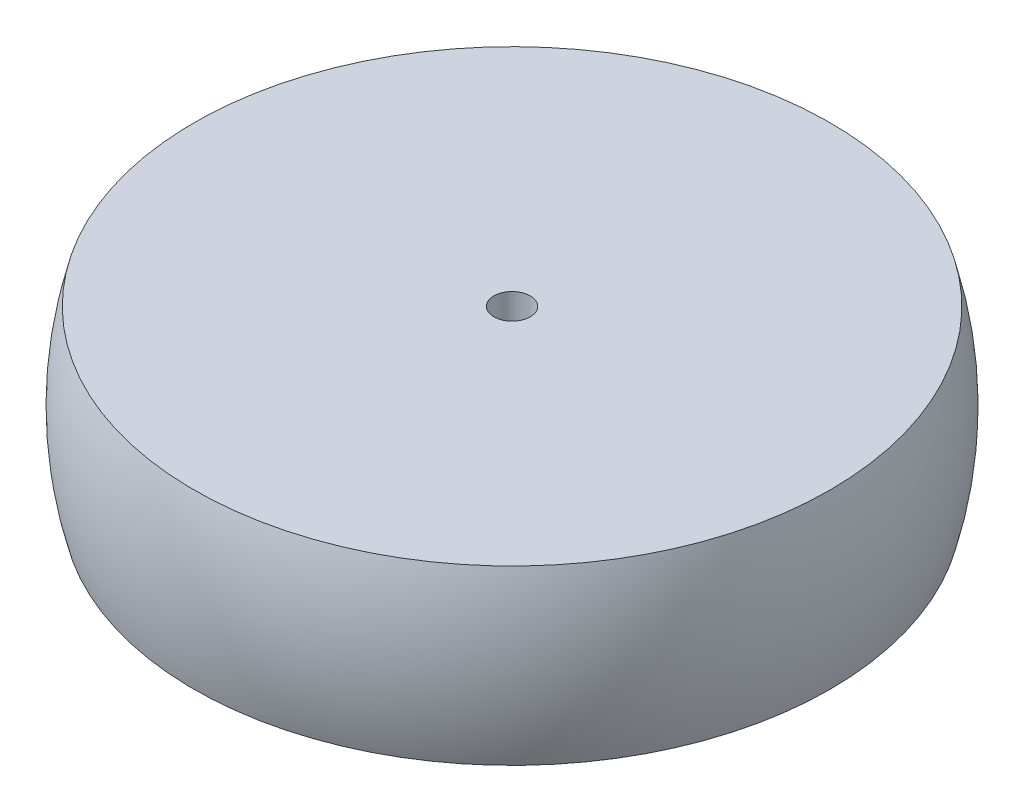
ISO-10303-21;
HEADER;
FILE_DESCRIPTION(('STEP AP214'),'2;1');
FILE_NAME('part.step','',(''),(''),'','','');
FILE_SCHEMA(('AUTOMOTIVE_DESIGN { 1 0 10303 214 1 1 1 1 }'));
ENDSEC;
DATA;
#1=APPLICATION_CONTEXT('core data for automotive mechanical design processes');
#2=APPLICATION_PROTOCOL_DEFINITION('international standard','automotive_design',2000,#1);
#3=PRODUCT_CONTEXT('',#1,'mechanical');
#4=PRODUCT('Part','Part','',(#3));
#5=PRODUCT_RELATED_PRODUCT_CATEGORY('part','',(#4));
#6=PRODUCT_DEFINITION_FORMATION('','',#4);
#7=PRODUCT_DEFINITION_CONTEXT('part definition',#1,'design');
#8=PRODUCT_DEFINITION('design','',#6,#7);
#9=PRODUCT_DEFINITION_SHAPE('','',#8);
#10=(LENGTH_UNIT() NAMED_UNIT(*) SI_UNIT(.MILLI.,.METRE.));
#11=(NAMED_UNIT(*) PLANE_ANGLE_UNIT() SI_UNIT($,.RADIAN.));
#12=(NAMED_UNIT(*) SI_UNIT($,.STERADIAN.) SOLID_ANGLE_UNIT());
#13=UNCERTAINTY_MEASURE_WITH_UNIT(LENGTH_MEASURE(1.E-05),#10,'distance_accuracy_value','');
#14=(GEOMETRIC_REPRESENTATION_CONTEXT(3) GLOBAL_UNCERTAINTY_ASSIGNED_CONTEXT((#13)) GLOBAL_UNIT_ASSIGNED_CONTEXT((#10,
#11,#12)) REPRESENTATION_CONTEXT('',''));
#15=CARTESIAN_POINT('',(0.,0.,0.));
#16=DIRECTION('',(0.,0.,1.));
#17=DIRECTION('',(1.,0.,0.));
#18=AXIS2_PLACEMENT_3D('',#15,#16,#17);
#19=CARTESIAN_POINT('',(0.,0.,0.));
#20=DIRECTION('',(0.,-1.,0.));
#21=DIRECTION('',(0.,0.,-1.));
#22=AXIS2_PLACEMENT_3D('',#19,#20,#21);
#23=PLANE('',#22);
#24=CARTESIAN_POINT('',(0.,0.,0.));
#25=DIRECTION('',(0.,-1.,0.));
#26=DIRECTION('',(0.,0.,-1.));
#27=AXIS2_PLACEMENT_3D('',#24,#25,#26);
#28=CIRCLE('',#27,2.);
#29=CARTESIAN_POINT('',(0.,0.,-2.));
#30=VERTEX_POINT('',#29);
#31=EDGE_CURVE('E50',#30,#30,#28,.T.);
#32=ORIENTED_EDGE('',*,*,#31,.F.);
#33=EDGE_LOOP('',(#32));
#34=FACE_BOUND('',#33,.T.);
#35=CARTESIAN_POINT('',(0.,0.,0.));
#36=DIRECTION('',(0.,-1.,0.));
#37=DIRECTION('',(0.,0.,-1.));
#38=AXIS2_PLACEMENT_3D('',#35,#36,#37);
#39=CIRCLE('',#38,6.);
#40=CARTESIAN_POINT('',(0.,0.,-6.));
#41=VERTEX_POINT('',#40);
#42=EDGE_CURVE('E44',#41,#41,#39,.T.);
#43=ORIENTED_EDGE('',*,*,#42,.T.);
#44=EDGE_LOOP('',(#43));
#45=FACE_BOUND('',#44,.T.);
#46=ADVANCED_FACE('F30',(#34,#45),#23,.T.);
#47=CARTESIAN_POINT('',(0.,25.,0.));
#48=DIRECTION('',(0.,1.,0.));
#49=DIRECTION('',(0.,0.,1.));
#50=AXIS2_PLACEMENT_3D('',#47,#48,#49);
#51=PLANE('',#50);
#52=CARTESIAN_POINT('',(0.,25.,0.));
#53=DIRECTION('',(0.,-1.,0.));
#54=DIRECTION('',(0.,0.,-1.));
#55=AXIS2_PLACEMENT_3D('',#52,#53,#54);
#56=CIRCLE('',#55,2.);
#57=CARTESIAN_POINT('',(0.,25.,-2.));
#58=VERTEX_POINT('',#57);
#59=EDGE_CURVE('E49',#58,#58,#56,.T.);
#60=ORIENTED_EDGE('',*,*,#59,.T.);
#61=EDGE_LOOP('',(#60));
#62=FACE_BOUND('',#61,.T.);
#63=CARTESIAN_POINT('',(0.,25.,0.));
#64=DIRECTION('',(0.,-1.,0.));
#65=DIRECTION('',(0.,0.,-1.));
#66=AXIS2_PLACEMENT_3D('',#63,#64,#65);
#67=CIRCLE('',#66,35.);
#68=CARTESIAN_POINT('',(35.,25.,0.));
#69=VERTEX_POINT('',#68);
#70=EDGE_CURVE('E10',#69,#69,#67,.T.);
#71=ORIENTED_EDGE('',*,*,#70,.F.);
#72=EDGE_LOOP('',(#71));
#73=FACE_BOUND('',#72,.T.);
#74=ADVANCED_FACE('F56',(#62,#73),#51,.T.);
#75=CARTESIAN_POINT('',(0.,15.5,0.));
#76=DIRECTION('',(0.,-1.,0.));
#77=DIRECTION('',(1.,0.,0.));
#78=AXIS2_PLACEMENT_3D('',#75,#76,#77);
#79=SPHERICAL_SURFACE('',#78,36.2663756115772);
#80=CARTESIAN_POINT('',(0.,6.00000000000001,0.));
#81=DIRECTION('',(0.,-1.,0.));
#82=DIRECTION('',(0.,0.,-1.));
#83=AXIS2_PLACEMENT_3D('',#80,#81,#82);
#84=CIRCLE('',#83,35.);
#85=CARTESIAN_POINT('',(35.,6.00000000000001,0.));
#86=VERTEX_POINT('',#85);
#87=EDGE_CURVE('E36',#86,#86,#84,.T.);
#88=CARTESIAN_POINT('',(35.,25.,0.));
#89=CARTESIAN_POINT('',(35.0524565577586,24.8067396216016,0.));
#90=CARTESIAN_POINT('',(35.1033121078223,24.6130446888307,0.));
#91=CARTESIAN_POINT('',(35.2018079336769,24.2248390407598,0.));
#92=CARTESIAN_POINT('',(35.2494482094679,24.0303283254598,0.));
#93=CARTESIAN_POINT('',(35.3415002278942,23.6405444385466,0.));
#94=CARTESIAN_POINT('',(35.3859119705294,23.4452712669333,0.));
#95=CARTESIAN_POINT('',(35.4714947860698,23.054016062807,0.));
#96=CARTESIAN_POINT('',(35.512665858975,22.8580340302938,0.));
#97=CARTESIAN_POINT('',(35.5917560243733,22.46541487822,0.));
#98=CARTESIAN_POINT('',(35.6296751168664,22.2687777586594,0.));
#99=CARTESIAN_POINT('',(35.702250920071,21.8749023904043,0.));
#100=CARTESIAN_POINT('',(35.7369076307825,21.6776641417099,0.));
#101=CARTESIAN_POINT('',(35.8029491597007,21.2826406368964,0.));
#102=CARTESIAN_POINT('',(35.8343339779072,21.0848553807774,0.));
#103=CARTESIAN_POINT('',(35.8938231101143,20.6887921332313,0.));
#104=CARTESIAN_POINT('',(35.9219274241147,20.4905141418042,0.));
#105=CARTESIAN_POINT('',(35.9748478360484,20.0935198308817,0.));
#106=CARTESIAN_POINT('',(35.9996639339816,19.8948035113862,0.));
#107=CARTESIAN_POINT('',(36.0460011042901,19.4969870718654,0.));
#108=CARTESIAN_POINT('',(36.0675221766653,19.2978869518401,0.));
#109=CARTESIAN_POINT('',(36.1072633904949,18.8993575441069,0.));
#110=CARTESIAN_POINT('',(36.1254835319492,18.6999282563989,0.));
#111=CARTESIAN_POINT('',(36.1586178843519,18.3007952364722,0.));
#112=CARTESIAN_POINT('',(36.1735320953004,18.1010915042535,0.));
#113=CARTESIAN_POINT('',(36.2000504942483,17.701464393784,0.));
#114=CARTESIAN_POINT('',(36.2116546822479,17.5015410155333,0.));
#115=CARTESIAN_POINT('',(36.2315498511221,17.1015294717494,0.));
#116=CARTESIAN_POINT('',(36.2398408319967,16.9014413062162,0.));
#117=CARTESIAN_POINT('',(36.2531073115853,16.5011550918342,0.));
#118=CARTESIAN_POINT('',(36.2580828102993,16.3009570429854,0.));
#119=CARTESIAN_POINT('',(36.2647169602952,15.9005059960911,0.));
#120=CARTESIAN_POINT('',(36.2663756115772,15.7002529980456,0.));
#121=CARTESIAN_POINT('',(36.2663756115772,15.2997470019545,0.));
#122=CARTESIAN_POINT('',(36.2647169602952,15.0994940039089,0.));
#123=CARTESIAN_POINT('',(36.2580828102993,14.6990429570146,0.));
#124=CARTESIAN_POINT('',(36.2531073115853,14.4988449081658,0.));
#125=CARTESIAN_POINT('',(36.2398408319967,14.0985586937838,0.));
#126=CARTESIAN_POINT('',(36.2315498511221,13.8984705282506,0.));
#127=CARTESIAN_POINT('',(36.2116546822479,13.4984589844667,0.));
#128=CARTESIAN_POINT('',(36.2000504942483,13.298535606216,0.));
#129=CARTESIAN_POINT('',(36.1735320953004,12.8989084957465,0.));
#130=CARTESIAN_POINT('',(36.1586178843519,12.6992047635278,0.));
#131=CARTESIAN_POINT('',(36.1254835319492,12.3000717436011,0.));
#132=CARTESIAN_POINT('',(36.1072633904949,12.1006424558931,0.));
#133=CARTESIAN_POINT('',(36.0675221766653,11.7021130481599,0.));
#134=CARTESIAN_POINT('',(36.0460011042901,11.5030129281346,0.));
#135=CARTESIAN_POINT('',(35.9996639339816,11.1051964886138,0.));
#136=CARTESIAN_POINT('',(35.9748478360484,10.9064801691183,0.));
#137=CARTESIAN_POINT('',(35.9219274241147,10.5094858581958,0.));
#138=CARTESIAN_POINT('',(35.8938231101143,10.3112078667687,0.));
#139=CARTESIAN_POINT('',(35.8343339779072,9.91514461922258,0.));
#140=CARTESIAN_POINT('',(35.8029491597007,9.71735936310357,0.));
#141=CARTESIAN_POINT('',(35.7369076307825,9.32233585829016,0.));
#142=CARTESIAN_POINT('',(35.702250920071,9.12509760959576,0.));
#143=CARTESIAN_POINT('',(35.6296751168664,8.73122224134067,0.));
#144=CARTESIAN_POINT('',(35.5917560243733,8.53458512177998,0.));
#145=CARTESIAN_POINT('',(35.5126658589751,8.14196596970617,0.));
#146=CARTESIAN_POINT('',(35.4714947860698,7.94598393719306,0.));
#147=CARTESIAN_POINT('',(35.3859119705294,7.5547287330667,0.));
#148=CARTESIAN_POINT('',(35.3415002278942,7.35945556145346,0.));
#149=CARTESIAN_POINT('',(35.2494482094679,6.96967167454023,0.));
#150=CARTESIAN_POINT('',(35.201807933677,6.77516095924023,0.));
#151=CARTESIAN_POINT('',(35.1033121078223,6.38695531116934,0.));
#152=CARTESIAN_POINT('',(35.0524565577586,6.19326037839844,0.));
#153=CARTESIAN_POINT('',(35.,6.00000000000001,0.));
#154=B_SPLINE_CURVE_WITH_KNOTS('',3,(#88,#89,#90,#91,#92,#93,#94,#95,#96,#97,#98,#99,#100,#101,
#102,#103,#104,#105,#106,#107,#108,#109,#110,#111,#112,#113,#114,#115,#116,#117,#118,#119,#120,
#121,#122,#123,#124,#125,#126,#127,#128,#129,#130,#131,#132,#133,#134,#135,#136,#137,#138,#139,
#140,#141,#142,#143,#144,#145,#146,#147,#148,#149,#150,#151,#152,#153),.UNSPECIFIED.,.F.,.F.,(4,
2,2,2,2,2,2,2,2,2,2,2,2,2,2,2,2,2,2,2,2,2,2,2,2,2,2,2,2,2,2,2,4),(0.,0.600752125604871,
1.20150425120975,1.80225637681462,2.40300850241949,3.00376062802436,3.60451275362924,
4.20526487923411,4.80601700483899,5.40676913044386,6.00752125604873,6.60827338165361,
7.20902550725848,7.80977763286335,8.41052975846823,9.0112818840731,9.61203400967797,
10.2127861352828,10.8135382608877,11.4142903864926,12.0150425120975,12.6157946377023,
13.2165467633072,13.8172988889121,14.418051014517,15.0188031401218,15.6195552657267,
16.2203073913316,16.8210595169365,17.4218116425413,18.0225637681462,18.6233158937511,
19.2240680193559),.UNSPECIFIED.);
#155=EDGE_CURVE('BSEAM77',#69,#86,#154,.T.);
#156=ORIENTED_EDGE('',*,*,#70,.T.);
#157=ORIENTED_EDGE('',*,*,#87,.F.);
#158=ORIENTED_EDGE('',*,*,#155,.T.);
#159=ORIENTED_EDGE('',*,*,#155,.F.);
#160=EDGE_LOOP('',(#156,#158,#157,#159));
#161=FACE_BOUND('',#160,.T.);
#162=ADVANCED_FACE('F77',(#161),#79,.T.);
#163=CARTESIAN_POINT('',(6.,6.00000000000001,0.));
#164=DIRECTION('',(0.,-1.,0.));
#165=DIRECTION('',(0.,0.,-1.));
#166=AXIS2_PLACEMENT_3D('',#163,#164,#165);
#167=PLANE('',#166);
#168=ORIENTED_EDGE('',*,*,#87,.T.);
#169=EDGE_LOOP('',(#168));
#170=FACE_BOUND('',#169,.T.);
#171=CARTESIAN_POINT('',(0.,6.,0.));
#172=DIRECTION('',(0.,-1.,0.));
#173=DIRECTION('',(0.,0.,-1.));
#174=AXIS2_PLACEMENT_3D('',#171,#172,#173);
#175=CIRCLE('',#174,6.);
#176=CARTESIAN_POINT('',(0.,6.,-6.));
#177=VERTEX_POINT('',#176);
#178=EDGE_CURVE('E40',#177,#177,#175,.T.);
#179=ORIENTED_EDGE('',*,*,#178,.F.);
#180=EDGE_LOOP('',(#179));
#181=FACE_BOUND('',#180,.T.);
#182=ADVANCED_FACE('F71',(#170,#181),#167,.T.);
#183=CARTESIAN_POINT('',(0.,0.,0.));
#184=DIRECTION('',(0.,-1.,0.));
#185=DIRECTION('',(0.,0.,-1.));
#186=AXIS2_PLACEMENT_3D('',#183,#184,#185);
#187=CYLINDRICAL_SURFACE('',#186,6.);
#188=ORIENTED_EDGE('',*,*,#178,.T.);
#189=EDGE_LOOP('',(#188));
#190=FACE_BOUND('',#189,.T.);
#191=ORIENTED_EDGE('',*,*,#42,.F.);
#192=EDGE_LOOP('',(#191));
#193=FACE_BOUND('',#192,.T.);
#194=ADVANCED_FACE('F62',(#190,#193),#187,.T.);
#195=CARTESIAN_POINT('',(0.,25.,0.));
#196=DIRECTION('',(0.,-1.,0.));
#197=DIRECTION('',(0.,0.,-1.));
#198=AXIS2_PLACEMENT_3D('',#195,#196,#197);
#199=CYLINDRICAL_SURFACE('',#198,2.);
#200=ORIENTED_EDGE('',*,*,#59,.F.);
#201=EDGE_LOOP('',(#200));
#202=FACE_BOUND('',#201,.T.);
#203=ORIENTED_EDGE('',*,*,#31,.T.);
#204=EDGE_LOOP('',(#203));
#205=FACE_BOUND('',#204,.T.);
#206=ADVANCED_FACE('F59',(#202,#205),#199,.F.);
#207=CLOSED_SHELL('',(#46,#74,#162,#182,#194,#206));
#208=MANIFOLD_SOLID_BREP('B2',#207);
#209=ADVANCED_BREP_SHAPE_REPRESENTATION('',(#18,#208),#14);
#210=SHAPE_DEFINITION_REPRESENTATION(#9,#209);
ENDSEC;
END-ISO-10303-21;
